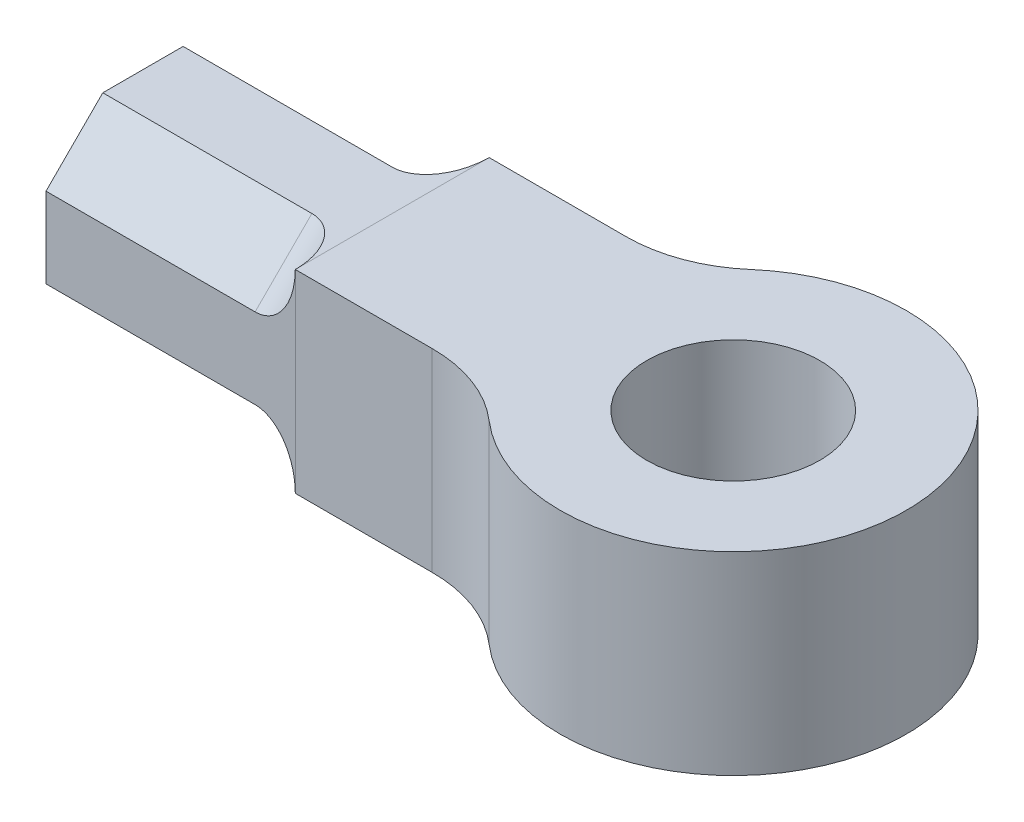
ISO-10303-21;
HEADER;
FILE_DESCRIPTION(('STEP AP214'),'2;1');
FILE_NAME('part.step','',(''),(''),'','','');
FILE_SCHEMA(('AUTOMOTIVE_DESIGN { 1 0 10303 214 1 1 1 1 }'));
ENDSEC;
DATA;
#1=APPLICATION_CONTEXT('core data for automotive mechanical design processes');
#2=APPLICATION_PROTOCOL_DEFINITION('international standard','automotive_design',2000,#1);
#3=PRODUCT_CONTEXT('',#1,'mechanical');
#4=PRODUCT('Part','Part','',(#3));
#5=PRODUCT_RELATED_PRODUCT_CATEGORY('part','',(#4));
#6=PRODUCT_DEFINITION_FORMATION('','',#4);
#7=PRODUCT_DEFINITION_CONTEXT('part definition',#1,'design');
#8=PRODUCT_DEFINITION('design','',#6,#7);
#9=PRODUCT_DEFINITION_SHAPE('','',#8);
#10=(LENGTH_UNIT() NAMED_UNIT(*) SI_UNIT(.MILLI.,.METRE.));
#11=(NAMED_UNIT(*) PLANE_ANGLE_UNIT() SI_UNIT($,.RADIAN.));
#12=(NAMED_UNIT(*) SI_UNIT($,.STERADIAN.) SOLID_ANGLE_UNIT());
#13=UNCERTAINTY_MEASURE_WITH_UNIT(LENGTH_MEASURE(1.E-05),#10,'distance_accuracy_value','');
#14=(GEOMETRIC_REPRESENTATION_CONTEXT(3) GLOBAL_UNCERTAINTY_ASSIGNED_CONTEXT((#13)) GLOBAL_UNIT_ASSIGNED_CONTEXT((#10,
#11,#12)) REPRESENTATION_CONTEXT('',''));
#15=CARTESIAN_POINT('',(0.,0.,0.));
#16=DIRECTION('',(0.,0.,1.));
#17=DIRECTION('',(1.,0.,0.));
#18=AXIS2_PLACEMENT_3D('',#15,#16,#17);
#19=CARTESIAN_POINT('',(0.,14.,0.));
#20=DIRECTION('',(0.,1.,0.));
#21=DIRECTION('',(0.,0.,1.));
#22=AXIS2_PLACEMENT_3D('',#19,#20,#21);
#23=PLANE('',#22);
#24=DIRECTION('',(1.,0.,0.));
#25=VECTOR('',#24,1.);
#26=CARTESIAN_POINT('',(-20.712315177208,14.,14.));
#27=LINE('',#26,#25);
#28=CARTESIAN_POINT('',(-49.2574031890661,14.,14.));
#29=VERTEX_POINT('',#28);
#30=CARTESIAN_POINT('',(-29.4788059459673,14.,14.));
#31=VERTEX_POINT('',#30);
#32=EDGE_CURVE('E456',#29,#31,#27,.T.);
#33=ORIENTED_EDGE('',*,*,#32,.T.);
#34=CARTESIAN_POINT('',(-29.4788059459673,14.,34.));
#35=DIRECTION('',(0.,1.,0.));
#36=DIRECTION('',(0.,0.,1.));
#37=AXIS2_PLACEMENT_3D('',#34,#35,#36);
#38=CIRCLE('',#37,20.);
#39=CARTESIAN_POINT('',(-16.3771144144263,14.,18.8888888888889));
#40=VERTEX_POINT('',#39);
#41=EDGE_CURVE('E11',#31,#40,#38,.F.);
#42=ORIENTED_EDGE('',*,*,#41,.T.);
#43=CARTESIAN_POINT('',(0.,14.,0.));
#44=DIRECTION('',(0.,1.,0.));
#45=DIRECTION('',(0.,0.,1.));
#46=AXIS2_PLACEMENT_3D('',#43,#44,#45);
#47=CIRCLE('',#46,25.);
#48=CARTESIAN_POINT('',(-16.3771144144263,14.,-18.8888888888889));
#49=VERTEX_POINT('',#48);
#50=EDGE_CURVE('E477',#40,#49,#47,.T.);
#51=ORIENTED_EDGE('',*,*,#50,.T.);
#52=CARTESIAN_POINT('',(-29.4788059459674,14.,-34.));
#53=DIRECTION('',(0.,1.,0.));
#54=DIRECTION('',(0.,0.,1.));
#55=AXIS2_PLACEMENT_3D('',#52,#53,#54);
#56=CIRCLE('',#55,20.);
#57=CARTESIAN_POINT('',(-29.4788059459674,14.,-14.));
#58=VERTEX_POINT('',#57);
#59=EDGE_CURVE('E490',#49,#58,#56,.F.);
#60=ORIENTED_EDGE('',*,*,#59,.T.);
#61=DIRECTION('',(-1.,0.,0.));
#62=VECTOR('',#61,1.);
#63=CARTESIAN_POINT('',(-20.712315177208,14.,-14.));
#64=LINE('',#63,#62);
#65=CARTESIAN_POINT('',(-49.2574031890661,14.,-14.));
#66=VERTEX_POINT('',#65);
#67=EDGE_CURVE('E464',#58,#66,#64,.T.);
#68=ORIENTED_EDGE('',*,*,#67,.T.);
#69=CARTESIAN_POINT('',(-49.2574031890661,14.0026025531612,-5.80100949861895));
#70=DIRECTION('',(0.,0.,-1.));
#71=VECTOR('',#70,1.);
#72=LINE('',#69,#71);
#73=CARTESIAN_POINT('',(-49.2574031890661,14.0007193280022,-5.80100949861895));
#74=VERTEX_POINT('',#73);
#75=EDGE_CURVE('E315',#74,#66,#72,.T.);
#76=ORIENTED_EDGE('',*,*,#75,.F.);
#77=CARTESIAN_POINT('',(-49.2574031890661,14.0026025531612,5.8000678860395));
#78=DIRECTION('',(0.,0.,-1.));
#79=VECTOR('',#78,1.);
#80=LINE('',#77,#79);
#81=CARTESIAN_POINT('',(-49.2574031890661,14.0007193280022,5.80100949861897));
#82=VERTEX_POINT('',#81);
#83=EDGE_CURVE('E559',#82,#74,#80,.T.);
#84=ORIENTED_EDGE('',*,*,#83,.F.);
#85=CARTESIAN_POINT('',(-49.2574031890661,14.,5.80100949861897));
#86=DIRECTION('',(0.,0.,1.));
#87=VECTOR('',#86,1.);
#88=LINE('',#85,#87);
#89=EDGE_CURVE('E518',#82,#29,#88,.T.);
#90=ORIENTED_EDGE('',*,*,#89,.T.);
#91=EDGE_LOOP('',(#33,#42,#51,#60,#68,#76,#84,#90));
#92=FACE_BOUND('',#91,.T.);
#93=CARTESIAN_POINT('',(0.,14.,0.));
#94=DIRECTION('',(0.,1.,0.));
#95=DIRECTION('',(0.,0.,1.));
#96=AXIS2_PLACEMENT_3D('',#93,#94,#95);
#97=CIRCLE('',#96,12.5);
#98=CARTESIAN_POINT('',(0.,14.,12.5));
#99=VERTEX_POINT('',#98);
#100=EDGE_CURVE('E194',#99,#99,#97,.T.);
#101=ORIENTED_EDGE('',*,*,#100,.F.);
#102=EDGE_LOOP('',(#101));
#103=FACE_BOUND('',#102,.T.);
#104=ADVANCED_FACE('F39',(#92,#103),#23,.T.);
#105=CARTESIAN_POINT('',(0.,-14.,0.));
#106=DIRECTION('',(0.,1.,0.));
#107=DIRECTION('',(0.,0.,1.));
#108=AXIS2_PLACEMENT_3D('',#105,#106,#107);
#109=PLANE('',#108);
#110=CARTESIAN_POINT('',(0.,-14.,0.));
#111=DIRECTION('',(0.,1.,0.));
#112=DIRECTION('',(0.,0.,1.));
#113=AXIS2_PLACEMENT_3D('',#110,#111,#112);
#114=CIRCLE('',#113,25.);
#115=CARTESIAN_POINT('',(-16.3771144144263,-14.,18.8888888888889));
#116=VERTEX_POINT('',#115);
#117=CARTESIAN_POINT('',(-16.3771144144263,-14.,-18.8888888888889));
#118=VERTEX_POINT('',#117);
#119=EDGE_CURVE('E434',#116,#118,#114,.T.);
#120=ORIENTED_EDGE('',*,*,#119,.F.);
#121=CARTESIAN_POINT('',(-29.4788059459673,-14.,34.));
#122=DIRECTION('',(0.,1.,0.));
#123=DIRECTION('',(0.,0.,1.));
#124=AXIS2_PLACEMENT_3D('',#121,#122,#123);
#125=CIRCLE('',#124,20.);
#126=CARTESIAN_POINT('',(-29.4788059459673,-14.,14.));
#127=VERTEX_POINT('',#126);
#128=EDGE_CURVE('E47',#116,#127,#125,.T.);
#129=ORIENTED_EDGE('',*,*,#128,.T.);
#130=DIRECTION('',(1.,0.,0.));
#131=VECTOR('',#130,1.);
#132=CARTESIAN_POINT('',(-20.712315177208,-14.,14.));
#133=LINE('',#132,#131);
#134=CARTESIAN_POINT('',(-49.2574031890661,-14.,14.));
#135=VERTEX_POINT('',#134);
#136=EDGE_CURVE('E504',#135,#127,#133,.T.);
#137=ORIENTED_EDGE('',*,*,#136,.F.);
#138=CARTESIAN_POINT('',(-49.2574031890661,-14.0026025531612,5.80100949861898));
#139=DIRECTION('',(0.,0.,1.));
#140=VECTOR('',#139,1.);
#141=LINE('',#138,#140);
#142=CARTESIAN_POINT('',(-49.2574031890661,-14.0007193280022,5.80100949861898));
#143=VERTEX_POINT('',#142);
#144=EDGE_CURVE('E381',#143,#135,#141,.T.);
#145=ORIENTED_EDGE('',*,*,#144,.F.);
#146=CARTESIAN_POINT('',(-49.2574031890661,-14.0026025531612,-5.80006788603948));
#147=DIRECTION('',(0.,0.,1.));
#148=VECTOR('',#147,1.);
#149=LINE('',#146,#148);
#150=CARTESIAN_POINT('',(-49.2574031890661,-14.0007193280022,-5.80100949861895));
#151=VERTEX_POINT('',#150);
#152=EDGE_CURVE('E444',#151,#143,#149,.T.);
#153=ORIENTED_EDGE('',*,*,#152,.F.);
#154=CARTESIAN_POINT('',(-49.2574031890661,-14.,-5.80100949861895));
#155=DIRECTION('',(0.,0.,-1.));
#156=VECTOR('',#155,1.);
#157=LINE('',#154,#156);
#158=CARTESIAN_POINT('',(-49.2574031890661,-14.,-14.));
#159=VERTEX_POINT('',#158);
#160=EDGE_CURVE('E409',#151,#159,#157,.T.);
#161=ORIENTED_EDGE('',*,*,#160,.T.);
#162=DIRECTION('',(-1.,0.,0.));
#163=VECTOR('',#162,1.);
#164=CARTESIAN_POINT('',(-20.712315177208,-14.,-14.));
#165=LINE('',#164,#163);
#166=CARTESIAN_POINT('',(-29.4788059459674,-14.,-14.));
#167=VERTEX_POINT('',#166);
#168=EDGE_CURVE('E478',#167,#159,#165,.T.);
#169=ORIENTED_EDGE('',*,*,#168,.F.);
#170=CARTESIAN_POINT('',(-29.4788059459674,-14.,-34.));
#171=DIRECTION('',(0.,1.,0.));
#172=DIRECTION('',(0.,0.,1.));
#173=AXIS2_PLACEMENT_3D('',#170,#171,#172);
#174=CIRCLE('',#173,20.);
#175=EDGE_CURVE('E488',#167,#118,#174,.T.);
#176=ORIENTED_EDGE('',*,*,#175,.T.);
#177=EDGE_LOOP('',(#120,#129,#137,#145,#153,#161,#169,#176));
#178=FACE_BOUND('',#177,.T.);
#179=CARTESIAN_POINT('',(0.,-14.,0.));
#180=DIRECTION('',(0.,1.,0.));
#181=DIRECTION('',(0.,0.,1.));
#182=AXIS2_PLACEMENT_3D('',#179,#180,#181);
#183=CIRCLE('',#182,12.5);
#184=CARTESIAN_POINT('',(0.,-14.,12.5));
#185=VERTEX_POINT('',#184);
#186=EDGE_CURVE('E191',#185,#185,#183,.T.);
#187=ORIENTED_EDGE('',*,*,#186,.T.);
#188=EDGE_LOOP('',(#187));
#189=FACE_BOUND('',#188,.T.);
#190=ADVANCED_FACE('F418',(#178,#189),#109,.F.);
#191=CARTESIAN_POINT('',(0.,14.,0.));
#192=DIRECTION('',(0.,-1.,0.));
#193=DIRECTION('',(0.,0.,-1.));
#194=AXIS2_PLACEMENT_3D('',#191,#192,#193);
#195=CYLINDRICAL_SURFACE('',#194,25.);
#196=ORIENTED_EDGE('',*,*,#119,.T.);
#197=DIRECTION('',(0.,-1.,0.));
#198=VECTOR('',#197,1.);
#199=CARTESIAN_POINT('',(-16.3771144144263,14.,-18.8888888888889));
#200=LINE('',#199,#198);
#201=EDGE_CURVE('E485',#118,#49,#200,.F.);
#202=ORIENTED_EDGE('',*,*,#201,.T.);
#203=ORIENTED_EDGE('',*,*,#50,.F.);
#204=DIRECTION('',(0.,-1.,0.));
#205=VECTOR('',#204,1.);
#206=CARTESIAN_POINT('',(-16.3771144144263,14.,18.8888888888889));
#207=LINE('',#206,#205);
#208=EDGE_CURVE('E482',#40,#116,#207,.T.);
#209=ORIENTED_EDGE('',*,*,#208,.T.);
#210=EDGE_LOOP('',(#196,#202,#203,#209));
#211=FACE_BOUND('',#210,.T.);
#212=ADVANCED_FACE('F267',(#211),#195,.T.);
#213=CARTESIAN_POINT('',(-20.712315177208,14.,-14.));
#214=DIRECTION('',(0.,0.,1.));
#215=DIRECTION('',(1.,0.,0.));
#216=AXIS2_PLACEMENT_3D('',#213,#214,#215);
#217=PLANE('',#216);
#218=ORIENTED_EDGE('',*,*,#67,.F.);
#219=DIRECTION('',(0.,1.,0.));
#220=VECTOR('',#219,1.);
#221=CARTESIAN_POINT('',(-29.4788059459674,-14.,-14.));
#222=LINE('',#221,#220);
#223=EDGE_CURVE('E479',#58,#167,#222,.F.);
#224=ORIENTED_EDGE('',*,*,#223,.T.);
#225=ORIENTED_EDGE('',*,*,#168,.T.);
#226=CARTESIAN_POINT('',(-49.2574031890661,-5.80100949861896,-14.0026025531612));
#227=DIRECTION('',(0.,-1.,0.));
#228=VECTOR('',#227,1.);
#229=LINE('',#226,#228);
#230=CARTESIAN_POINT('',(-49.2574031890661,-5.80100949861897,-14.0007193280022));
#231=VERTEX_POINT('',#230);
#232=EDGE_CURVE('E248',#231,#159,#229,.T.);
#233=ORIENTED_EDGE('',*,*,#232,.F.);
#234=CARTESIAN_POINT('',(-49.2574031890661,5.80006788603949,-14.0026025531612));
#235=DIRECTION('',(0.,-1.,0.));
#236=VECTOR('',#235,1.);
#237=LINE('',#234,#236);
#238=CARTESIAN_POINT('',(-49.2574031890661,5.80100949861896,-14.0007193280022));
#239=VERTEX_POINT('',#238);
#240=EDGE_CURVE('E213',#239,#231,#237,.T.);
#241=ORIENTED_EDGE('',*,*,#240,.F.);
#242=CARTESIAN_POINT('',(-49.2574031890661,5.80100949861896,-14.));
#243=DIRECTION('',(0.,1.,0.));
#244=VECTOR('',#243,1.);
#245=LINE('',#242,#244);
#246=EDGE_CURVE('E299',#239,#66,#245,.T.);
#247=ORIENTED_EDGE('',*,*,#246,.T.);
#248=EDGE_LOOP('',(#218,#224,#225,#233,#241,#247));
#249=FACE_BOUND('',#248,.T.);
#250=ADVANCED_FACE('F256',(#249),#217,.F.);
#251=CARTESIAN_POINT('',(-20.712315177208,14.,14.));
#252=DIRECTION('',(0.,0.,-1.));
#253=DIRECTION('',(-1.,0.,0.));
#254=AXIS2_PLACEMENT_3D('',#251,#252,#253);
#255=PLANE('',#254);
#256=ORIENTED_EDGE('',*,*,#136,.T.);
#257=DIRECTION('',(0.,1.,0.));
#258=VECTOR('',#257,1.);
#259=CARTESIAN_POINT('',(-29.4788059459673,14.,14.));
#260=LINE('',#259,#258);
#261=EDGE_CURVE('E54',#127,#31,#260,.T.);
#262=ORIENTED_EDGE('',*,*,#261,.T.);
#263=ORIENTED_EDGE('',*,*,#32,.F.);
#264=CARTESIAN_POINT('',(-49.2574031890661,5.80100949861896,14.0026025531612));
#265=DIRECTION('',(0.,1.,0.));
#266=VECTOR('',#265,1.);
#267=LINE('',#264,#266);
#268=CARTESIAN_POINT('',(-49.2574031890661,5.80100949861896,14.0007193280022));
#269=VERTEX_POINT('',#268);
#270=EDGE_CURVE('E345',#269,#29,#267,.T.);
#271=ORIENTED_EDGE('',*,*,#270,.F.);
#272=CARTESIAN_POINT('',(-49.2574031890661,-5.80006788603949,14.0026025531612));
#273=DIRECTION('',(0.,1.,0.));
#274=VECTOR('',#273,1.);
#275=LINE('',#272,#274);
#276=CARTESIAN_POINT('',(-49.2574031890661,-5.80100949861896,14.0007193280023));
#277=VERTEX_POINT('',#276);
#278=EDGE_CURVE('E185',#277,#269,#275,.T.);
#279=ORIENTED_EDGE('',*,*,#278,.F.);
#280=CARTESIAN_POINT('',(-49.2574031890661,-5.80100949861896,14.));
#281=DIRECTION('',(0.,-1.,0.));
#282=VECTOR('',#281,1.);
#283=LINE('',#280,#282);
#284=EDGE_CURVE('E512',#277,#135,#283,.T.);
#285=ORIENTED_EDGE('',*,*,#284,.T.);
#286=EDGE_LOOP('',(#256,#262,#263,#271,#279,#285));
#287=FACE_BOUND('',#286,.T.);
#288=ADVANCED_FACE('F266',(#287),#255,.F.);
#289=CARTESIAN_POINT('',(0.,14.,0.));
#290=DIRECTION('',(0.,-1.,0.));
#291=DIRECTION('',(0.,0.,-1.));
#292=AXIS2_PLACEMENT_3D('',#289,#290,#291);
#293=CYLINDRICAL_SURFACE('',#292,12.5);
#294=ORIENTED_EDGE('',*,*,#100,.T.);
#295=EDGE_LOOP('',(#294));
#296=FACE_BOUND('',#295,.T.);
#297=ORIENTED_EDGE('',*,*,#186,.F.);
#298=EDGE_LOOP('',(#297));
#299=FACE_BOUND('',#298,.T.);
#300=ADVANCED_FACE('F641',(#296,#299),#293,.F.);
#301=CARTESIAN_POINT('',(-85.2574031890661,5.80006788603949,14.0026025531612));
#302=DIRECTION('',(0.,-0.707106781186548,-0.707106781186547));
#303=DIRECTION('',(0.,0.707106781186547,-0.707106781186548));
#304=AXIS2_PLACEMENT_3D('',#301,#302,#303);
#305=PLANE('',#304);
#306=DIRECTION('',(1.,0.,0.));
#307=VECTOR('',#306,1.);
#308=CARTESIAN_POINT('',(-85.2574031890661,5.80006788603949,14.0026025531612));
#309=LINE('',#308,#307);
#310=CARTESIAN_POINT('',(-85.2574031890661,5.80006788603949,14.0026025531612));
#311=VERTEX_POINT('',#310);
#312=CARTESIAN_POINT('',(-55.0574031890661,5.80006788603949,14.0026025531612));
#313=VERTEX_POINT('',#312);
#314=EDGE_CURVE('E563',#311,#313,#309,.T.);
#315=ORIENTED_EDGE('',*,*,#314,.T.);
#316=DIRECTION('',(0.,0.707106781186547,-0.707106781186548));
#317=VECTOR('',#316,1.);
#318=CARTESIAN_POINT('',(-55.0574031890661,14.0026025531612,5.8000678860395));
#319=LINE('',#318,#317);
#320=CARTESIAN_POINT('',(-55.0574031890661,14.0026025531612,5.8000678860395));
#321=VERTEX_POINT('',#320);
#322=EDGE_CURVE('E190',#313,#321,#319,.T.);
#323=ORIENTED_EDGE('',*,*,#322,.T.);
#324=DIRECTION('',(1.,0.,0.));
#325=VECTOR('',#324,1.);
#326=CARTESIAN_POINT('',(-85.2574031890661,14.0026025531612,5.80006788603951));
#327=LINE('',#326,#325);
#328=CARTESIAN_POINT('',(-85.2574031890661,14.0026025531612,5.80006788603951));
#329=VERTEX_POINT('',#328);
#330=EDGE_CURVE('E170',#329,#321,#327,.T.);
#331=ORIENTED_EDGE('',*,*,#330,.F.);
#332=DIRECTION('',(0.,0.707106781186547,-0.707106781186548));
#333=VECTOR('',#332,1.);
#334=CARTESIAN_POINT('',(-85.2574031890661,5.80006788603949,14.0026025531612));
#335=LINE('',#334,#333);
#336=EDGE_CURVE('E176',#311,#329,#335,.T.);
#337=ORIENTED_EDGE('',*,*,#336,.F.);
#338=EDGE_LOOP('',(#315,#323,#331,#337));
#339=FACE_BOUND('',#338,.T.);
#340=ADVANCED_FACE('F188',(#339),#305,.F.);
#341=CARTESIAN_POINT('',(-85.2574031890661,14.0026025531612,5.80006788603951));
#342=DIRECTION('',(0.,-1.,0.));
#343=DIRECTION('',(0.,0.,-1.));
#344=AXIS2_PLACEMENT_3D('',#341,#342,#343);
#345=PLANE('',#344);
#346=ORIENTED_EDGE('',*,*,#83,.T.);
#347=ORIENTED_EDGE('',*,*,#75,.T.);
#348=CARTESIAN_POINT('',(-55.0574031890661,14.0026025531612,-14.0025065478034));
#349=DIRECTION('',(0.,-1.,0.));
#350=DIRECTION('',(0.,0.,1.));
#351=AXIS2_PLACEMENT_3D('',#348,#349,#350);
#352=ELLIPSE('',#351,8.20243866176395,5.8);
#353=CARTESIAN_POINT('',(-55.0574031890661,14.0026025531612,-5.80006788603948));
#354=VERTEX_POINT('',#353);
#355=EDGE_CURVE('E523',#66,#354,#352,.T.);
#356=ORIENTED_EDGE('',*,*,#355,.T.);
#357=DIRECTION('',(1.,0.,0.));
#358=VECTOR('',#357,1.);
#359=CARTESIAN_POINT('',(-85.2574031890661,14.0026025531612,-5.80006788603947));
#360=LINE('',#359,#358);
#361=CARTESIAN_POINT('',(-85.2574031890661,14.0026025531612,-5.80006788603947));
#362=VERTEX_POINT('',#361);
#363=EDGE_CURVE('E172',#362,#354,#360,.T.);
#364=ORIENTED_EDGE('',*,*,#363,.F.);
#365=DIRECTION('',(0.,0.,-1.));
#366=VECTOR('',#365,1.);
#367=CARTESIAN_POINT('',(-85.2574031890661,14.0026025531612,5.80006788603951));
#368=LINE('',#367,#366);
#369=EDGE_CURVE('E164',#329,#362,#368,.T.);
#370=ORIENTED_EDGE('',*,*,#369,.F.);
#371=ORIENTED_EDGE('',*,*,#330,.T.);
#372=CARTESIAN_POINT('',(-55.0574031890661,14.0026025531612,14.0025065478034));
#373=DIRECTION('',(0.,-1.,0.));
#374=DIRECTION('',(0.,0.,1.));
#375=AXIS2_PLACEMENT_3D('',#372,#373,#374);
#376=ELLIPSE('',#375,8.20243866176395,5.8);
#377=EDGE_CURVE('E520',#321,#29,#376,.T.);
#378=ORIENTED_EDGE('',*,*,#377,.T.);
#379=ORIENTED_EDGE('',*,*,#89,.F.);
#380=EDGE_LOOP('',(#346,#347,#356,#364,#370,#371,#378,#379));
#381=FACE_BOUND('',#380,.T.);
#382=ADVANCED_FACE('F167',(#381),#345,.F.);
#383=CARTESIAN_POINT('',(-85.2574031890661,14.0026025531612,-5.80006788603947));
#384=DIRECTION('',(0.,-0.707106781186547,0.707106781186548));
#385=DIRECTION('',(0.,-0.707106781186548,-0.707106781186547));
#386=AXIS2_PLACEMENT_3D('',#383,#384,#385);
#387=PLANE('',#386);
#388=ORIENTED_EDGE('',*,*,#363,.T.);
#389=DIRECTION('',(0.,-0.707106781186548,-0.707106781186547));
#390=VECTOR('',#389,1.);
#391=CARTESIAN_POINT('',(-55.0574031890661,5.80006788603948,-14.0026025531612));
#392=LINE('',#391,#390);
#393=CARTESIAN_POINT('',(-55.0574031890661,5.80006788603949,-14.0026025531612));
#394=VERTEX_POINT('',#393);
#395=EDGE_CURVE('E552',#354,#394,#392,.T.);
#396=ORIENTED_EDGE('',*,*,#395,.T.);
#397=DIRECTION('',(1.,0.,0.));
#398=VECTOR('',#397,1.);
#399=CARTESIAN_POINT('',(-85.2574031890661,5.80006788603949,-14.0026025531612));
#400=LINE('',#399,#398);
#401=CARTESIAN_POINT('',(-85.2574031890661,5.80006788603949,-14.0026025531612));
#402=VERTEX_POINT('',#401);
#403=EDGE_CURVE('E196',#402,#394,#400,.T.);
#404=ORIENTED_EDGE('',*,*,#403,.F.);
#405=DIRECTION('',(0.,-0.707106781186548,-0.707106781186547));
#406=VECTOR('',#405,1.);
#407=CARTESIAN_POINT('',(-85.2574031890661,14.0026025531612,-5.80006788603947));
#408=LINE('',#407,#406);
#409=EDGE_CURVE('E175',#362,#402,#408,.T.);
#410=ORIENTED_EDGE('',*,*,#409,.F.);
#411=EDGE_LOOP('',(#388,#396,#404,#410));
#412=FACE_BOUND('',#411,.T.);
#413=ADVANCED_FACE('F230',(#412),#387,.F.);
#414=CARTESIAN_POINT('',(-85.2574031890661,5.80006788603949,-14.0026025531612));
#415=DIRECTION('',(0.,0.,1.));
#416=DIRECTION('',(1.,0.,0.));
#417=AXIS2_PLACEMENT_3D('',#414,#415,#416);
#418=PLANE('',#417);
#419=ORIENTED_EDGE('',*,*,#240,.T.);
#420=ORIENTED_EDGE('',*,*,#232,.T.);
#421=CARTESIAN_POINT('',(-55.0574031890661,-14.0025065478034,-14.0026025531612));
#422=DIRECTION('',(0.,0.,1.));
#423=DIRECTION('',(0.,1.,0.));
#424=AXIS2_PLACEMENT_3D('',#421,#422,#423);
#425=ELLIPSE('',#424,8.20243866176395,5.8);
#426=CARTESIAN_POINT('',(-55.0574031890661,-5.8000678860395,-14.0026025531612));
#427=VERTEX_POINT('',#426);
#428=EDGE_CURVE('E543',#159,#427,#425,.T.);
#429=ORIENTED_EDGE('',*,*,#428,.T.);
#430=DIRECTION('',(1.,0.,0.));
#431=VECTOR('',#430,1.);
#432=CARTESIAN_POINT('',(-85.2574031890661,-5.8000678860395,-14.0026025531612));
#433=LINE('',#432,#431);
#434=CARTESIAN_POINT('',(-85.2574031890661,-5.8000678860395,-14.0026025531612));
#435=VERTEX_POINT('',#434);
#436=EDGE_CURVE('E578',#435,#427,#433,.T.);
#437=ORIENTED_EDGE('',*,*,#436,.F.);
#438=DIRECTION('',(0.,-1.,0.));
#439=VECTOR('',#438,1.);
#440=CARTESIAN_POINT('',(-85.2574031890661,5.80006788603949,-14.0026025531612));
#441=LINE('',#440,#439);
#442=EDGE_CURVE('E597',#402,#435,#441,.T.);
#443=ORIENTED_EDGE('',*,*,#442,.F.);
#444=ORIENTED_EDGE('',*,*,#403,.T.);
#445=CARTESIAN_POINT('',(-55.0574031890661,14.0025065478034,-14.0026025531612));
#446=DIRECTION('',(0.,0.,1.));
#447=DIRECTION('',(0.,1.,0.));
#448=AXIS2_PLACEMENT_3D('',#445,#446,#447);
#449=ELLIPSE('',#448,8.20243866176395,5.8);
#450=EDGE_CURVE('E525',#394,#66,#449,.T.);
#451=ORIENTED_EDGE('',*,*,#450,.T.);
#452=ORIENTED_EDGE('',*,*,#246,.F.);
#453=EDGE_LOOP('',(#419,#420,#429,#437,#443,#444,#451,#452));
#454=FACE_BOUND('',#453,.T.);
#455=ADVANCED_FACE('F219',(#454),#418,.F.);
#456=CARTESIAN_POINT('',(-85.2574031890661,-5.8000678860395,-14.0026025531612));
#457=DIRECTION('',(0.,0.707106781186548,0.707106781186547));
#458=DIRECTION('',(0.,-0.707106781186547,0.707106781186548));
#459=AXIS2_PLACEMENT_3D('',#456,#457,#458);
#460=PLANE('',#459);
#461=ORIENTED_EDGE('',*,*,#436,.T.);
#462=DIRECTION('',(0.,-0.707106781186547,0.707106781186548));
#463=VECTOR('',#462,1.);
#464=CARTESIAN_POINT('',(-55.0574031890661,-14.0026025531612,-5.80006788603948));
#465=LINE('',#464,#463);
#466=CARTESIAN_POINT('',(-55.0574031890661,-14.0026025531612,-5.80006788603948));
#467=VERTEX_POINT('',#466);
#468=EDGE_CURVE('E463',#427,#467,#465,.T.);
#469=ORIENTED_EDGE('',*,*,#468,.T.);
#470=DIRECTION('',(1.,0.,0.));
#471=VECTOR('',#470,1.);
#472=CARTESIAN_POINT('',(-85.2574031890661,-14.0026025531612,-5.80006788603947));
#473=LINE('',#472,#471);
#474=CARTESIAN_POINT('',(-85.2574031890661,-14.0026025531612,-5.80006788603947));
#475=VERTEX_POINT('',#474);
#476=EDGE_CURVE('E571',#475,#467,#473,.T.);
#477=ORIENTED_EDGE('',*,*,#476,.F.);
#478=DIRECTION('',(0.,-0.707106781186547,0.707106781186548));
#479=VECTOR('',#478,1.);
#480=CARTESIAN_POINT('',(-85.2574031890661,-5.8000678860395,-14.0026025531612));
#481=LINE('',#480,#479);
#482=EDGE_CURVE('E592',#435,#475,#481,.T.);
#483=ORIENTED_EDGE('',*,*,#482,.F.);
#484=EDGE_LOOP('',(#461,#469,#477,#483));
#485=FACE_BOUND('',#484,.T.);
#486=ADVANCED_FACE('F229',(#485),#460,.F.);
#487=CARTESIAN_POINT('',(-85.2574031890661,-14.0026025531612,-5.80006788603947));
#488=DIRECTION('',(0.,1.,0.));
#489=DIRECTION('',(0.,0.,1.));
#490=AXIS2_PLACEMENT_3D('',#487,#488,#489);
#491=PLANE('',#490);
#492=ORIENTED_EDGE('',*,*,#152,.T.);
#493=ORIENTED_EDGE('',*,*,#144,.T.);
#494=CARTESIAN_POINT('',(-55.0574031890661,-14.0026025531612,14.0025065478035));
#495=DIRECTION('',(0.,1.,0.));
#496=DIRECTION('',(0.,0.,-1.));
#497=AXIS2_PLACEMENT_3D('',#494,#495,#496);
#498=ELLIPSE('',#497,8.20243866176395,5.8);
#499=CARTESIAN_POINT('',(-55.0574031890661,-14.0026025531612,5.80006788603951));
#500=VERTEX_POINT('',#499);
#501=EDGE_CURVE('E535',#135,#500,#498,.T.);
#502=ORIENTED_EDGE('',*,*,#501,.T.);
#503=DIRECTION('',(1.,0.,0.));
#504=VECTOR('',#503,1.);
#505=CARTESIAN_POINT('',(-85.2574031890661,-14.0026025531612,5.80006788603951));
#506=LINE('',#505,#504);
#507=CARTESIAN_POINT('',(-85.2574031890661,-14.0026025531612,5.80006788603951));
#508=VERTEX_POINT('',#507);
#509=EDGE_CURVE('E568',#508,#500,#506,.T.);
#510=ORIENTED_EDGE('',*,*,#509,.F.);
#511=DIRECTION('',(0.,0.,1.));
#512=VECTOR('',#511,1.);
#513=CARTESIAN_POINT('',(-85.2574031890661,-14.0026025531612,-5.80006788603947));
#514=LINE('',#513,#512);
#515=EDGE_CURVE('E754',#475,#508,#514,.T.);
#516=ORIENTED_EDGE('',*,*,#515,.F.);
#517=ORIENTED_EDGE('',*,*,#476,.T.);
#518=CARTESIAN_POINT('',(-55.0574031890661,-14.0026025531612,-14.0025065478034));
#519=DIRECTION('',(0.,1.,0.));
#520=DIRECTION('',(0.,0.,-1.));
#521=AXIS2_PLACEMENT_3D('',#518,#519,#520);
#522=ELLIPSE('',#521,8.20243866176395,5.8);
#523=EDGE_CURVE('E547',#467,#159,#522,.T.);
#524=ORIENTED_EDGE('',*,*,#523,.T.);
#525=ORIENTED_EDGE('',*,*,#160,.F.);
#526=EDGE_LOOP('',(#492,#493,#502,#510,#516,#517,#524,#525));
#527=FACE_BOUND('',#526,.T.);
#528=ADVANCED_FACE('F384',(#527),#491,.F.);
#529=CARTESIAN_POINT('',(-85.2574031890661,-14.0026025531612,5.80006788603951));
#530=DIRECTION('',(0.,0.707106781186547,-0.707106781186548));
#531=DIRECTION('',(0.,0.707106781186548,0.707106781186547));
#532=AXIS2_PLACEMENT_3D('',#529,#530,#531);
#533=PLANE('',#532);
#534=ORIENTED_EDGE('',*,*,#509,.T.);
#535=DIRECTION('',(0.,0.707106781186548,0.707106781186547));
#536=VECTOR('',#535,1.);
#537=CARTESIAN_POINT('',(-55.0574031890661,-5.80006788603949,14.0026025531612));
#538=LINE('',#537,#536);
#539=CARTESIAN_POINT('',(-55.0574031890661,-5.80006788603949,14.0026025531612));
#540=VERTEX_POINT('',#539);
#541=EDGE_CURVE('E555',#500,#540,#538,.T.);
#542=ORIENTED_EDGE('',*,*,#541,.T.);
#543=DIRECTION('',(1.,0.,0.));
#544=VECTOR('',#543,1.);
#545=CARTESIAN_POINT('',(-85.2574031890661,-5.80006788603949,14.0026025531612));
#546=LINE('',#545,#544);
#547=CARTESIAN_POINT('',(-85.2574031890661,-5.80006788603949,14.0026025531612));
#548=VERTEX_POINT('',#547);
#549=EDGE_CURVE('E565',#548,#540,#546,.T.);
#550=ORIENTED_EDGE('',*,*,#549,.F.);
#551=DIRECTION('',(0.,0.707106781186548,0.707106781186547));
#552=VECTOR('',#551,1.);
#553=CARTESIAN_POINT('',(-85.2574031890661,-14.0026025531612,5.80006788603951));
#554=LINE('',#553,#552);
#555=EDGE_CURVE('E752',#508,#548,#554,.T.);
#556=ORIENTED_EDGE('',*,*,#555,.F.);
#557=EDGE_LOOP('',(#534,#542,#550,#556));
#558=FACE_BOUND('',#557,.T.);
#559=ADVANCED_FACE('F361',(#558),#533,.F.);
#560=CARTESIAN_POINT('',(-85.2574031890661,-5.80006788603949,14.0026025531612));
#561=DIRECTION('',(0.,0.,-1.));
#562=DIRECTION('',(0.,1.,0.));
#563=AXIS2_PLACEMENT_3D('',#560,#561,#562);
#564=PLANE('',#563);
#565=ORIENTED_EDGE('',*,*,#278,.T.);
#566=ORIENTED_EDGE('',*,*,#270,.T.);
#567=CARTESIAN_POINT('',(-55.0574031890661,14.0025065478034,14.0026025531612));
#568=DIRECTION('',(0.,0.,-1.));
#569=DIRECTION('',(0.,-1.,0.));
#570=AXIS2_PLACEMENT_3D('',#567,#568,#569);
#571=ELLIPSE('',#570,8.20243866176395,5.8);
#572=EDGE_CURVE('E522',#29,#313,#571,.T.);
#573=ORIENTED_EDGE('',*,*,#572,.T.);
#574=ORIENTED_EDGE('',*,*,#314,.F.);
#575=DIRECTION('',(0.,1.,0.));
#576=VECTOR('',#575,1.);
#577=CARTESIAN_POINT('',(-85.2574031890661,-5.80006788603949,14.0026025531612));
#578=LINE('',#577,#576);
#579=EDGE_CURVE('E181',#548,#311,#578,.T.);
#580=ORIENTED_EDGE('',*,*,#579,.F.);
#581=ORIENTED_EDGE('',*,*,#549,.T.);
#582=CARTESIAN_POINT('',(-55.0574031890661,-14.0025065478034,14.0026025531612));
#583=DIRECTION('',(0.,0.,-1.));
#584=DIRECTION('',(0.,-1.,0.));
#585=AXIS2_PLACEMENT_3D('',#582,#583,#584);
#586=ELLIPSE('',#585,8.20243866176395,5.8);
#587=EDGE_CURVE('E539',#540,#135,#586,.T.);
#588=ORIENTED_EDGE('',*,*,#587,.T.);
#589=ORIENTED_EDGE('',*,*,#284,.F.);
#590=EDGE_LOOP('',(#565,#566,#573,#574,#580,#581,#588,#589));
#591=FACE_BOUND('',#590,.T.);
#592=ADVANCED_FACE('F351',(#591),#564,.F.);
#593=CARTESIAN_POINT('',(-85.2574031890661,0.,0.));
#594=DIRECTION('',(-1.,0.,0.));
#595=DIRECTION('',(0.,0.,1.));
#596=AXIS2_PLACEMENT_3D('',#593,#594,#595);
#597=PLANE('',#596);
#598=ORIENTED_EDGE('',*,*,#336,.T.);
#599=ORIENTED_EDGE('',*,*,#369,.T.);
#600=ORIENTED_EDGE('',*,*,#409,.T.);
#601=ORIENTED_EDGE('',*,*,#442,.T.);
#602=ORIENTED_EDGE('',*,*,#482,.T.);
#603=ORIENTED_EDGE('',*,*,#515,.T.);
#604=ORIENTED_EDGE('',*,*,#555,.T.);
#605=ORIENTED_EDGE('',*,*,#579,.T.);
#606=EDGE_LOOP('',(#598,#599,#600,#601,#602,#603,#604,#605));
#607=FACE_BOUND('',#606,.T.);
#608=ADVANCED_FACE('F179',(#607),#597,.T.);
#609=CARTESIAN_POINT('',(-55.0574031890661,-9.90128721692148,-18.1038218840431));
#610=DIRECTION('',(0.,0.707106781186547,-0.707106781186548));
#611=DIRECTION('',(0.,0.707106781186548,0.707106781186547));
#612=AXIS2_PLACEMENT_3D('',#609,#610,#611);
#613=CYLINDRICAL_SURFACE('',#612,5.8);
#614=ORIENTED_EDGE('',*,*,#468,.F.);
#615=ORIENTED_EDGE('',*,*,#428,.F.);
#616=ORIENTED_EDGE('',*,*,#523,.F.);
#617=EDGE_LOOP('',(#614,#615,#616));
#618=FACE_BOUND('',#617,.T.);
#619=ADVANCED_FACE('F589',(#618),#613,.F.);
#620=CARTESIAN_POINT('',(-55.0574031890661,-18.1038218840432,9.90128721692148));
#621=DIRECTION('',(0.,-0.707106781186548,-0.707106781186547));
#622=DIRECTION('',(0.,0.707106781186547,-0.707106781186548));
#623=AXIS2_PLACEMENT_3D('',#620,#621,#622);
#624=CYLINDRICAL_SURFACE('',#623,5.8);
#625=ORIENTED_EDGE('',*,*,#541,.F.);
#626=ORIENTED_EDGE('',*,*,#501,.F.);
#627=ORIENTED_EDGE('',*,*,#587,.F.);
#628=EDGE_LOOP('',(#625,#626,#627));
#629=FACE_BOUND('',#628,.T.);
#630=ADVANCED_FACE('F604',(#629),#624,.F.);
#631=CARTESIAN_POINT('',(-55.0574031890661,18.1038218840431,-9.90128721692146));
#632=DIRECTION('',(0.,0.707106781186548,0.707106781186547));
#633=DIRECTION('',(0.,-0.707106781186547,0.707106781186548));
#634=AXIS2_PLACEMENT_3D('',#631,#632,#633);
#635=CYLINDRICAL_SURFACE('',#634,5.8);
#636=ORIENTED_EDGE('',*,*,#395,.F.);
#637=ORIENTED_EDGE('',*,*,#355,.F.);
#638=ORIENTED_EDGE('',*,*,#450,.F.);
#639=EDGE_LOOP('',(#636,#637,#638));
#640=FACE_BOUND('',#639,.T.);
#641=ADVANCED_FACE('F601',(#640),#635,.F.);
#642=CARTESIAN_POINT('',(-55.0574031890661,9.90128721692147,18.1038218840432));
#643=DIRECTION('',(0.,-0.707106781186547,0.707106781186548));
#644=DIRECTION('',(0.,-0.707106781186548,-0.707106781186547));
#645=AXIS2_PLACEMENT_3D('',#642,#643,#644);
#646=CYLINDRICAL_SURFACE('',#645,5.8);
#647=ORIENTED_EDGE('',*,*,#322,.F.);
#648=ORIENTED_EDGE('',*,*,#572,.F.);
#649=ORIENTED_EDGE('',*,*,#377,.F.);
#650=EDGE_LOOP('',(#647,#648,#649));
#651=FACE_BOUND('',#650,.T.);
#652=ADVANCED_FACE('F603',(#651),#646,.F.);
#653=CARTESIAN_POINT('',(-29.4788059459674,14.,-34.));
#654=DIRECTION('',(0.,-1.,0.));
#655=DIRECTION('',(0.,0.,-1.));
#656=AXIS2_PLACEMENT_3D('',#653,#654,#655);
#657=CYLINDRICAL_SURFACE('',#656,20.);
#658=ORIENTED_EDGE('',*,*,#59,.F.);
#659=ORIENTED_EDGE('',*,*,#201,.F.);
#660=ORIENTED_EDGE('',*,*,#175,.F.);
#661=ORIENTED_EDGE('',*,*,#223,.F.);
#662=EDGE_LOOP('',(#658,#659,#660,#661));
#663=FACE_BOUND('',#662,.T.);
#664=ADVANCED_FACE('F499',(#663),#657,.F.);
#665=CARTESIAN_POINT('',(-29.4788059459673,14.,34.));
#666=DIRECTION('',(0.,-1.,0.));
#667=DIRECTION('',(0.,0.,-1.));
#668=AXIS2_PLACEMENT_3D('',#665,#666,#667);
#669=CYLINDRICAL_SURFACE('',#668,20.);
#670=ORIENTED_EDGE('',*,*,#41,.F.);
#671=ORIENTED_EDGE('',*,*,#261,.F.);
#672=ORIENTED_EDGE('',*,*,#128,.F.);
#673=ORIENTED_EDGE('',*,*,#208,.F.);
#674=EDGE_LOOP('',(#670,#671,#672,#673));
#675=FACE_BOUND('',#674,.T.);
#676=ADVANCED_FACE('F41',(#675),#669,.F.);
#677=CLOSED_SHELL('',(#104,#190,#212,#250,#288,#300,#340,#382,#413,#455,#486,#528,#559,#592,
#608,#619,#630,#641,#652,#664,#676));
#678=MANIFOLD_SOLID_BREP('B2',#677);
#679=ADVANCED_BREP_SHAPE_REPRESENTATION('',(#18,#678),#14);
#680=SHAPE_DEFINITION_REPRESENTATION(#9,#679);
ENDSEC;
END-ISO-10303-21;
